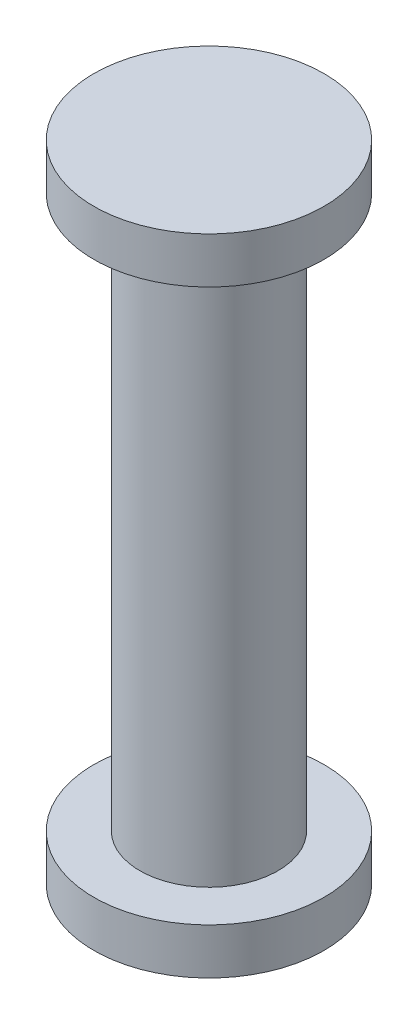
ISO-10303-21;
HEADER;
FILE_DESCRIPTION(('STEP AP214'),'2;1');
FILE_NAME('part.step','',(''),(''),'','','');
FILE_SCHEMA(('AUTOMOTIVE_DESIGN { 1 0 10303 214 1 1 1 1 }'));
ENDSEC;
DATA;
#1=APPLICATION_CONTEXT('core data for automotive mechanical design processes');
#2=APPLICATION_PROTOCOL_DEFINITION('international standard','automotive_design',2000,#1);
#3=PRODUCT_CONTEXT('',#1,'mechanical');
#4=PRODUCT('Part','Part','',(#3));
#5=PRODUCT_RELATED_PRODUCT_CATEGORY('part','',(#4));
#6=PRODUCT_DEFINITION_FORMATION('','',#4);
#7=PRODUCT_DEFINITION_CONTEXT('part definition',#1,'design');
#8=PRODUCT_DEFINITION('design','',#6,#7);
#9=PRODUCT_DEFINITION_SHAPE('','',#8);
#10=(LENGTH_UNIT() NAMED_UNIT(*) SI_UNIT(.MILLI.,.METRE.));
#11=(NAMED_UNIT(*) PLANE_ANGLE_UNIT() SI_UNIT($,.RADIAN.));
#12=(NAMED_UNIT(*) SI_UNIT($,.STERADIAN.) SOLID_ANGLE_UNIT());
#13=UNCERTAINTY_MEASURE_WITH_UNIT(LENGTH_MEASURE(1.E-05),#10,'distance_accuracy_value','');
#14=(GEOMETRIC_REPRESENTATION_CONTEXT(3) GLOBAL_UNCERTAINTY_ASSIGNED_CONTEXT((#13)) GLOBAL_UNIT_ASSIGNED_CONTEXT((#10,
#11,#12)) REPRESENTATION_CONTEXT('',''));
#15=CARTESIAN_POINT('',(0.,0.,0.));
#16=DIRECTION('',(0.,0.,1.));
#17=DIRECTION('',(1.,0.,0.));
#18=AXIS2_PLACEMENT_3D('',#15,#16,#17);
#19=CARTESIAN_POINT('',(-2.5,0.,0.));
#20=DIRECTION('',(0.,1.,0.));
#21=DIRECTION('',(0.,0.,1.));
#22=AXIS2_PLACEMENT_3D('',#19,#20,#21);
#23=PLANE('',#22);
#24=CARTESIAN_POINT('',(0.,0.,0.));
#25=DIRECTION('',(0.,-1.,0.));
#26=DIRECTION('',(0.,0.,-1.));
#27=AXIS2_PLACEMENT_3D('',#24,#25,#26);
#28=CIRCLE('',#27,2.5);
#29=CARTESIAN_POINT('',(0.,0.,-2.5));
#30=VERTEX_POINT('',#29);
#31=EDGE_CURVE('E63',#30,#30,#28,.T.);
#32=ORIENTED_EDGE('',*,*,#31,.T.);
#33=EDGE_LOOP('',(#32));
#34=FACE_BOUND('',#33,.T.);
#35=ADVANCED_FACE('F41',(#34),#23,.F.);
#36=CARTESIAN_POINT('',(0.,14.,0.));
#37=DIRECTION('',(0.,-1.,0.));
#38=DIRECTION('',(0.,0.,-1.));
#39=AXIS2_PLACEMENT_3D('',#36,#37,#38);
#40=PLANE('',#39);
#41=CARTESIAN_POINT('',(0.,14.,0.));
#42=DIRECTION('',(0.,-1.,0.));
#43=DIRECTION('',(0.,0.,-1.));
#44=AXIS2_PLACEMENT_3D('',#41,#42,#43);
#45=CIRCLE('',#44,2.5);
#46=CARTESIAN_POINT('',(0.,14.,-2.5));
#47=VERTEX_POINT('',#46);
#48=EDGE_CURVE('E10',#47,#47,#45,.T.);
#49=ORIENTED_EDGE('',*,*,#48,.F.);
#50=EDGE_LOOP('',(#49));
#51=FACE_BOUND('',#50,.T.);
#52=ADVANCED_FACE('F93',(#51),#40,.F.);
#53=CARTESIAN_POINT('',(0.,0.,0.));
#54=DIRECTION('',(0.,-1.,0.));
#55=DIRECTION('',(0.,0.,-1.));
#56=AXIS2_PLACEMENT_3D('',#53,#54,#55);
#57=CYLINDRICAL_SURFACE('',#56,2.5);
#58=CARTESIAN_POINT('',(0.,13.,0.));
#59=DIRECTION('',(0.,-1.,0.));
#60=DIRECTION('',(0.,0.,-1.));
#61=AXIS2_PLACEMENT_3D('',#58,#59,#60);
#62=CIRCLE('',#61,2.5);
#63=CARTESIAN_POINT('',(0.,13.,-2.5));
#64=VERTEX_POINT('',#63);
#65=EDGE_CURVE('E47',#64,#64,#62,.T.);
#66=ORIENTED_EDGE('',*,*,#65,.F.);
#67=EDGE_LOOP('',(#66));
#68=FACE_BOUND('',#67,.T.);
#69=ORIENTED_EDGE('',*,*,#48,.T.);
#70=EDGE_LOOP('',(#69));
#71=FACE_BOUND('',#70,.T.);
#72=ADVANCED_FACE('F88',(#68,#71),#57,.T.);
#73=CARTESIAN_POINT('',(-2.5,13.,0.));
#74=DIRECTION('',(0.,1.,0.));
#75=DIRECTION('',(0.,0.,1.));
#76=AXIS2_PLACEMENT_3D('',#73,#74,#75);
#77=PLANE('',#76);
#78=CARTESIAN_POINT('',(0.,13.,0.));
#79=DIRECTION('',(0.,-1.,0.));
#80=DIRECTION('',(0.,0.,-1.));
#81=AXIS2_PLACEMENT_3D('',#78,#79,#80);
#82=CIRCLE('',#81,1.5);
#83=CARTESIAN_POINT('',(0.,13.,-1.5));
#84=VERTEX_POINT('',#83);
#85=EDGE_CURVE('E51',#84,#84,#82,.T.);
#86=ORIENTED_EDGE('',*,*,#85,.F.);
#87=EDGE_LOOP('',(#86));
#88=FACE_BOUND('',#87,.T.);
#89=ORIENTED_EDGE('',*,*,#65,.T.);
#90=EDGE_LOOP('',(#89));
#91=FACE_BOUND('',#90,.T.);
#92=ADVANCED_FACE('F83',(#88,#91),#77,.F.);
#93=CARTESIAN_POINT('',(0.,0.,0.));
#94=DIRECTION('',(0.,-1.,0.));
#95=DIRECTION('',(0.,0.,-1.));
#96=AXIS2_PLACEMENT_3D('',#93,#94,#95);
#97=CYLINDRICAL_SURFACE('',#96,1.5);
#98=CARTESIAN_POINT('',(0.,1.,0.));
#99=DIRECTION('',(0.,-1.,0.));
#100=DIRECTION('',(0.,0.,-1.));
#101=AXIS2_PLACEMENT_3D('',#98,#99,#100);
#102=CIRCLE('',#101,1.5);
#103=CARTESIAN_POINT('',(0.,1.,-1.5));
#104=VERTEX_POINT('',#103);
#105=EDGE_CURVE('E55',#104,#104,#102,.T.);
#106=ORIENTED_EDGE('',*,*,#105,.F.);
#107=EDGE_LOOP('',(#106));
#108=FACE_BOUND('',#107,.T.);
#109=ORIENTED_EDGE('',*,*,#85,.T.);
#110=EDGE_LOOP('',(#109));
#111=FACE_BOUND('',#110,.T.);
#112=ADVANCED_FACE('F77',(#108,#111),#97,.T.);
#113=CARTESIAN_POINT('',(-1.5,1.,0.));
#114=DIRECTION('',(0.,-1.,0.));
#115=DIRECTION('',(0.,0.,-1.));
#116=AXIS2_PLACEMENT_3D('',#113,#114,#115);
#117=PLANE('',#116);
#118=CARTESIAN_POINT('',(0.,1.,0.));
#119=DIRECTION('',(0.,-1.,0.));
#120=DIRECTION('',(0.,0.,-1.));
#121=AXIS2_PLACEMENT_3D('',#118,#119,#120);
#122=CIRCLE('',#121,2.5);
#123=CARTESIAN_POINT('',(0.,1.,-2.5));
#124=VERTEX_POINT('',#123);
#125=EDGE_CURVE('E60',#124,#124,#122,.T.);
#126=ORIENTED_EDGE('',*,*,#125,.F.);
#127=EDGE_LOOP('',(#126));
#128=FACE_BOUND('',#127,.T.);
#129=ORIENTED_EDGE('',*,*,#105,.T.);
#130=EDGE_LOOP('',(#129));
#131=FACE_BOUND('',#130,.T.);
#132=ADVANCED_FACE('F71',(#128,#131),#117,.F.);
#133=CARTESIAN_POINT('',(0.,0.,0.));
#134=DIRECTION('',(0.,-1.,0.));
#135=DIRECTION('',(0.,0.,-1.));
#136=AXIS2_PLACEMENT_3D('',#133,#134,#135);
#137=CYLINDRICAL_SURFACE('',#136,2.5);
#138=ORIENTED_EDGE('',*,*,#31,.F.);
#139=EDGE_LOOP('',(#138));
#140=FACE_BOUND('',#139,.T.);
#141=ORIENTED_EDGE('',*,*,#125,.T.);
#142=EDGE_LOOP('',(#141));
#143=FACE_BOUND('',#142,.T.);
#144=ADVANCED_FACE('F68',(#140,#143),#137,.T.);
#145=CLOSED_SHELL('',(#35,#52,#72,#92,#112,#132,#144));
#146=MANIFOLD_SOLID_BREP('B2',#145);
#147=ADVANCED_BREP_SHAPE_REPRESENTATION('',(#18,#146),#14);
#148=SHAPE_DEFINITION_REPRESENTATION(#9,#147);
ENDSEC;
END-ISO-10303-21;
